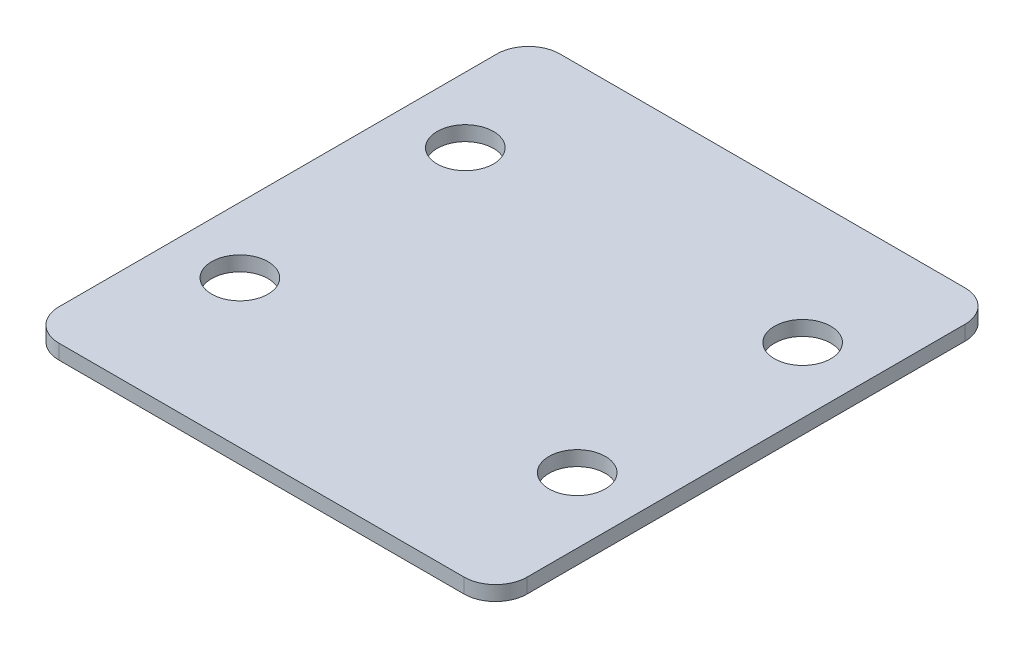
ISO-10303-21;
HEADER;
FILE_DESCRIPTION(('STEP AP214'),'2;1');
FILE_NAME('part.step','',(''),(''),'','','');
FILE_SCHEMA(('AUTOMOTIVE_DESIGN { 1 0 10303 214 1 1 1 1 }'));
ENDSEC;
DATA;
#1=APPLICATION_CONTEXT('core data for automotive mechanical design processes');
#2=APPLICATION_PROTOCOL_DEFINITION('international standard','automotive_design',2000,#1);
#3=PRODUCT_CONTEXT('',#1,'mechanical');
#4=PRODUCT('Part','Part','',(#3));
#5=PRODUCT_RELATED_PRODUCT_CATEGORY('part','',(#4));
#6=PRODUCT_DEFINITION_FORMATION('','',#4);
#7=PRODUCT_DEFINITION_CONTEXT('part definition',#1,'design');
#8=PRODUCT_DEFINITION('design','',#6,#7);
#9=PRODUCT_DEFINITION_SHAPE('','',#8);
#10=(LENGTH_UNIT() NAMED_UNIT(*) SI_UNIT(.MILLI.,.METRE.));
#11=(NAMED_UNIT(*) PLANE_ANGLE_UNIT() SI_UNIT($,.RADIAN.));
#12=(NAMED_UNIT(*) SI_UNIT($,.STERADIAN.) SOLID_ANGLE_UNIT());
#13=UNCERTAINTY_MEASURE_WITH_UNIT(LENGTH_MEASURE(1.E-05),#10,'distance_accuracy_value','');
#14=(GEOMETRIC_REPRESENTATION_CONTEXT(3) GLOBAL_UNCERTAINTY_ASSIGNED_CONTEXT((#13)) GLOBAL_UNIT_ASSIGNED_CONTEXT((#10,
#11,#12)) REPRESENTATION_CONTEXT('',''));
#15=CARTESIAN_POINT('',(0.,0.,0.));
#16=DIRECTION('',(0.,0.,1.));
#17=DIRECTION('',(1.,0.,0.));
#18=AXIS2_PLACEMENT_3D('',#15,#16,#17);
#19=CARTESIAN_POINT('',(28.2702,-29.2608,30.2514));
#20=DIRECTION('',(0.,-1.,0.));
#21=DIRECTION('',(0.,0.,-1.));
#22=AXIS2_PLACEMENT_3D('',#19,#20,#21);
#23=PLANE('',#22);
#24=CARTESIAN_POINT('',(24.3205,-29.2608,21.3741));
#25=DIRECTION('',(0.,1.,0.));
#26=DIRECTION('',(0.,0.,-1.));
#27=AXIS2_PLACEMENT_3D('',#24,#25,#26);
#28=CIRCLE('',#27,1.7018);
#29=CARTESIAN_POINT('',(24.3205,-29.2608,19.6723));
#30=VERTEX_POINT('',#29);
#31=EDGE_CURVE('E144',#30,#30,#28,.T.);
#32=ORIENTED_EDGE('',*,*,#31,.F.);
#33=EDGE_LOOP('',(#32));
#34=FACE_BOUND('',#33,.T.);
#35=CARTESIAN_POINT('',(3.9497,-29.2608,21.3741));
#36=DIRECTION('',(0.,1.,0.));
#37=DIRECTION('',(0.,0.,1.));
#38=AXIS2_PLACEMENT_3D('',#35,#36,#37);
#39=CIRCLE('',#38,1.7018);
#40=CARTESIAN_POINT('',(3.9497,-29.2608,23.0759));
#41=VERTEX_POINT('',#40);
#42=EDGE_CURVE('E156',#41,#41,#39,.T.);
#43=ORIENTED_EDGE('',*,*,#42,.F.);
#44=EDGE_LOOP('',(#43));
#45=FACE_BOUND('',#44,.T.);
#46=CARTESIAN_POINT('',(3.9497,-29.2608,7.7597));
#47=DIRECTION('',(0.,1.,0.));
#48=DIRECTION('',(0.,0.,-1.));
#49=AXIS2_PLACEMENT_3D('',#46,#47,#48);
#50=CIRCLE('',#49,1.7018);
#51=CARTESIAN_POINT('',(3.9497,-29.2608,6.0579));
#52=VERTEX_POINT('',#51);
#53=EDGE_CURVE('E147',#52,#52,#50,.T.);
#54=ORIENTED_EDGE('',*,*,#53,.F.);
#55=EDGE_LOOP('',(#54));
#56=FACE_BOUND('',#55,.T.);
#57=CARTESIAN_POINT('',(24.3205,-29.2608,7.7597));
#58=DIRECTION('',(0.,1.,0.));
#59=DIRECTION('',(0.,0.,1.));
#60=AXIS2_PLACEMENT_3D('',#57,#58,#59);
#61=CIRCLE('',#60,1.7018);
#62=CARTESIAN_POINT('',(24.3205,-29.2608,9.4615));
#63=VERTEX_POINT('',#62);
#64=EDGE_CURVE('E151',#63,#63,#61,.T.);
#65=ORIENTED_EDGE('',*,*,#64,.F.);
#66=EDGE_LOOP('',(#65));
#67=FACE_BOUND('',#66,.T.);
#68=DIRECTION('',(1.,0.,0.));
#69=VECTOR('',#68,1.);
#70=CARTESIAN_POINT('',(0.,-29.2608,0.));
#71=LINE('',#70,#69);
#72=CARTESIAN_POINT('',(1.905,-29.2608,0.));
#73=VERTEX_POINT('',#72);
#74=CARTESIAN_POINT('',(26.3652,-29.2608,0.));
#75=VERTEX_POINT('',#74);
#76=EDGE_CURVE('E130',#73,#75,#71,.T.);
#77=ORIENTED_EDGE('',*,*,#76,.F.);
#78=CARTESIAN_POINT('',(1.905,-29.2608,1.905));
#79=DIRECTION('',(0.,-1.,0.));
#80=DIRECTION('',(0.,0.,-1.));
#81=AXIS2_PLACEMENT_3D('',#78,#79,#80);
#82=CIRCLE('',#81,1.905);
#83=CARTESIAN_POINT('',(0.,-29.2608,1.905));
#84=VERTEX_POINT('',#83);
#85=EDGE_CURVE('E112',#73,#84,#82,.F.);
#86=ORIENTED_EDGE('',*,*,#85,.T.);
#87=DIRECTION('',(0.,0.,1.));
#88=VECTOR('',#87,1.);
#89=CARTESIAN_POINT('',(0.,-29.2608,30.2514));
#90=LINE('',#89,#88);
#91=CARTESIAN_POINT('',(0.,-29.2608,28.3464));
#92=VERTEX_POINT('',#91);
#93=EDGE_CURVE('E171',#84,#92,#90,.T.);
#94=ORIENTED_EDGE('',*,*,#93,.T.);
#95=CARTESIAN_POINT('',(1.905,-29.2608,28.3464));
#96=DIRECTION('',(0.,-1.,0.));
#97=DIRECTION('',(0.,0.,-1.));
#98=AXIS2_PLACEMENT_3D('',#95,#96,#97);
#99=CIRCLE('',#98,1.905);
#100=CARTESIAN_POINT('',(1.905,-29.2608,30.2514));
#101=VERTEX_POINT('',#100);
#102=EDGE_CURVE('E135',#92,#101,#99,.F.);
#103=ORIENTED_EDGE('',*,*,#102,.T.);
#104=DIRECTION('',(-1.,0.,0.));
#105=VECTOR('',#104,1.);
#106=CARTESIAN_POINT('',(28.2702,-29.2608,30.2514));
#107=LINE('',#106,#105);
#108=CARTESIAN_POINT('',(26.3652,-29.2608,30.2514));
#109=VERTEX_POINT('',#108);
#110=EDGE_CURVE('E194',#109,#101,#107,.T.);
#111=ORIENTED_EDGE('',*,*,#110,.F.);
#112=CARTESIAN_POINT('',(26.3652,-29.2608,28.3464));
#113=DIRECTION('',(0.,-1.,0.));
#114=DIRECTION('',(0.,0.,-1.));
#115=AXIS2_PLACEMENT_3D('',#112,#113,#114);
#116=CIRCLE('',#115,1.905);
#117=CARTESIAN_POINT('',(28.2702,-29.2608,28.3464));
#118=VERTEX_POINT('',#117);
#119=EDGE_CURVE('E202',#109,#118,#116,.F.);
#120=ORIENTED_EDGE('',*,*,#119,.T.);
#121=DIRECTION('',(0.,0.,1.));
#122=VECTOR('',#121,1.);
#123=CARTESIAN_POINT('',(28.2702,-29.2608,30.2514));
#124=LINE('',#123,#122);
#125=CARTESIAN_POINT('',(28.2702,-29.2608,1.905));
#126=VERTEX_POINT('',#125);
#127=EDGE_CURVE('E175',#126,#118,#124,.T.);
#128=ORIENTED_EDGE('',*,*,#127,.F.);
#129=CARTESIAN_POINT('',(26.3652,-29.2608,1.905));
#130=DIRECTION('',(0.,-1.,0.));
#131=DIRECTION('',(0.,0.,-1.));
#132=AXIS2_PLACEMENT_3D('',#129,#130,#131);
#133=CIRCLE('',#132,1.905);
#134=EDGE_CURVE('E124',#126,#75,#133,.F.);
#135=ORIENTED_EDGE('',*,*,#134,.T.);
#136=EDGE_LOOP('',(#77,#86,#94,#103,#111,#120,#128,#135));
#137=FACE_BOUND('',#136,.T.);
#138=ADVANCED_FACE('F45',(#34,#45,#56,#67,#137),#23,.F.);
#139=CARTESIAN_POINT('',(28.2702,-30.1498,30.2514));
#140=DIRECTION('',(0.,0.,-1.));
#141=DIRECTION('',(-1.,0.,0.));
#142=AXIS2_PLACEMENT_3D('',#139,#140,#141);
#143=PLANE('',#142);
#144=DIRECTION('',(-1.,0.,0.));
#145=VECTOR('',#144,1.);
#146=CARTESIAN_POINT('',(28.2702,-30.1498,30.2514));
#147=LINE('',#146,#145);
#148=CARTESIAN_POINT('',(26.3652,-30.1498,30.2514));
#149=VERTEX_POINT('',#148);
#150=CARTESIAN_POINT('',(1.905,-30.1498,30.2514));
#151=VERTEX_POINT('',#150);
#152=EDGE_CURVE('E191',#149,#151,#147,.T.);
#153=ORIENTED_EDGE('',*,*,#152,.F.);
#154=DIRECTION('',(0.,-1.,0.));
#155=VECTOR('',#154,1.);
#156=CARTESIAN_POINT('',(26.3652,-30.1498,30.2514));
#157=LINE('',#156,#155);
#158=EDGE_CURVE('E11',#149,#109,#157,.F.);
#159=ORIENTED_EDGE('',*,*,#158,.T.);
#160=ORIENTED_EDGE('',*,*,#110,.T.);
#161=DIRECTION('',(0.,-1.,0.));
#162=VECTOR('',#161,1.);
#163=CARTESIAN_POINT('',(1.905,-30.1498,30.2514));
#164=LINE('',#163,#162);
#165=EDGE_CURVE('E54',#101,#151,#164,.T.);
#166=ORIENTED_EDGE('',*,*,#165,.T.);
#167=EDGE_LOOP('',(#153,#159,#160,#166));
#168=FACE_BOUND('',#167,.T.);
#169=ADVANCED_FACE('F230',(#168),#143,.F.);
#170=CARTESIAN_POINT('',(28.2702,-30.1498,0.));
#171=DIRECTION('',(0.,1.,0.));
#172=DIRECTION('',(0.,0.,1.));
#173=AXIS2_PLACEMENT_3D('',#170,#171,#172);
#174=PLANE('',#173);
#175=CARTESIAN_POINT('',(24.3205,-30.1498,21.3741));
#176=DIRECTION('',(0.,1.,0.));
#177=DIRECTION('',(0.,0.,-1.));
#178=AXIS2_PLACEMENT_3D('',#175,#176,#177);
#179=CIRCLE('',#178,1.7018);
#180=CARTESIAN_POINT('',(24.3205,-30.1498,19.6723));
#181=VERTEX_POINT('',#180);
#182=EDGE_CURVE('E140',#181,#181,#179,.T.);
#183=ORIENTED_EDGE('',*,*,#182,.T.);
#184=EDGE_LOOP('',(#183));
#185=FACE_BOUND('',#184,.T.);
#186=CARTESIAN_POINT('',(3.9497,-30.1498,21.3741));
#187=DIRECTION('',(0.,1.,0.));
#188=DIRECTION('',(0.,0.,1.));
#189=AXIS2_PLACEMENT_3D('',#186,#187,#188);
#190=CIRCLE('',#189,1.7018);
#191=CARTESIAN_POINT('',(3.9497,-30.1498,23.0759));
#192=VERTEX_POINT('',#191);
#193=EDGE_CURVE('E160',#192,#192,#190,.T.);
#194=ORIENTED_EDGE('',*,*,#193,.T.);
#195=EDGE_LOOP('',(#194));
#196=FACE_BOUND('',#195,.T.);
#197=CARTESIAN_POINT('',(3.9497,-30.1498,7.7597));
#198=DIRECTION('',(0.,1.,0.));
#199=DIRECTION('',(0.,0.,-1.));
#200=AXIS2_PLACEMENT_3D('',#197,#198,#199);
#201=CIRCLE('',#200,1.7018);
#202=CARTESIAN_POINT('',(3.9497,-30.1498,6.0579));
#203=VERTEX_POINT('',#202);
#204=EDGE_CURVE('E152',#203,#203,#201,.T.);
#205=ORIENTED_EDGE('',*,*,#204,.T.);
#206=EDGE_LOOP('',(#205));
#207=FACE_BOUND('',#206,.T.);
#208=CARTESIAN_POINT('',(24.3205,-30.1498,7.7597));
#209=DIRECTION('',(0.,1.,0.));
#210=DIRECTION('',(0.,0.,1.));
#211=AXIS2_PLACEMENT_3D('',#208,#209,#210);
#212=CIRCLE('',#211,1.7018);
#213=CARTESIAN_POINT('',(24.3205,-30.1498,9.4615));
#214=VERTEX_POINT('',#213);
#215=EDGE_CURVE('E167',#214,#214,#212,.T.);
#216=ORIENTED_EDGE('',*,*,#215,.T.);
#217=EDGE_LOOP('',(#216));
#218=FACE_BOUND('',#217,.T.);
#219=DIRECTION('',(0.,0.,-1.));
#220=VECTOR('',#219,1.);
#221=CARTESIAN_POINT('',(0.,-30.1498,0.));
#222=LINE('',#221,#220);
#223=CARTESIAN_POINT('',(0.,-30.1498,28.3464));
#224=VERTEX_POINT('',#223);
#225=CARTESIAN_POINT('',(0.,-30.1498,1.905));
#226=VERTEX_POINT('',#225);
#227=EDGE_CURVE('E180',#224,#226,#222,.T.);
#228=ORIENTED_EDGE('',*,*,#227,.T.);
#229=CARTESIAN_POINT('',(1.905,-30.1498,1.905));
#230=DIRECTION('',(0.,1.,0.));
#231=DIRECTION('',(0.,0.,1.));
#232=AXIS2_PLACEMENT_3D('',#229,#230,#231);
#233=CIRCLE('',#232,1.905);
#234=CARTESIAN_POINT('',(1.905,-30.1498,0.));
#235=VERTEX_POINT('',#234);
#236=EDGE_CURVE('E218',#226,#235,#233,.F.);
#237=ORIENTED_EDGE('',*,*,#236,.T.);
#238=DIRECTION('',(-1.,0.,0.));
#239=VECTOR('',#238,1.);
#240=CARTESIAN_POINT('',(28.2702,-30.1498,0.));
#241=LINE('',#240,#239);
#242=CARTESIAN_POINT('',(26.3652,-30.1498,0.));
#243=VERTEX_POINT('',#242);
#244=EDGE_CURVE('E133',#243,#235,#241,.T.);
#245=ORIENTED_EDGE('',*,*,#244,.F.);
#246=CARTESIAN_POINT('',(26.3652,-30.1498,1.905));
#247=DIRECTION('',(0.,1.,0.));
#248=DIRECTION('',(0.,0.,1.));
#249=AXIS2_PLACEMENT_3D('',#246,#247,#248);
#250=CIRCLE('',#249,1.905);
#251=CARTESIAN_POINT('',(28.2702,-30.1498,1.905));
#252=VERTEX_POINT('',#251);
#253=EDGE_CURVE('E215',#243,#252,#250,.F.);
#254=ORIENTED_EDGE('',*,*,#253,.T.);
#255=DIRECTION('',(0.,0.,-1.));
#256=VECTOR('',#255,1.);
#257=CARTESIAN_POINT('',(28.2702,-30.1498,0.));
#258=LINE('',#257,#256);
#259=CARTESIAN_POINT('',(28.2702,-30.1498,28.3464));
#260=VERTEX_POINT('',#259);
#261=EDGE_CURVE('E179',#260,#252,#258,.T.);
#262=ORIENTED_EDGE('',*,*,#261,.F.);
#263=CARTESIAN_POINT('',(26.3652,-30.1498,28.3464));
#264=DIRECTION('',(0.,1.,0.));
#265=DIRECTION('',(0.,0.,1.));
#266=AXIS2_PLACEMENT_3D('',#263,#264,#265);
#267=CIRCLE('',#266,1.905);
#268=EDGE_CURVE('E69',#260,#149,#267,.F.);
#269=ORIENTED_EDGE('',*,*,#268,.T.);
#270=ORIENTED_EDGE('',*,*,#152,.T.);
#271=CARTESIAN_POINT('',(1.905,-30.1498,28.3464));
#272=DIRECTION('',(0.,1.,0.));
#273=DIRECTION('',(0.,0.,1.));
#274=AXIS2_PLACEMENT_3D('',#271,#272,#273);
#275=CIRCLE('',#274,1.905);
#276=EDGE_CURVE('E61',#151,#224,#275,.F.);
#277=ORIENTED_EDGE('',*,*,#276,.T.);
#278=EDGE_LOOP('',(#228,#237,#245,#254,#262,#269,#270,#277));
#279=FACE_BOUND('',#278,.T.);
#280=ADVANCED_FACE('F234',(#185,#196,#207,#218,#279),#174,.F.);
#281=CARTESIAN_POINT('',(28.2702,0.,0.));
#282=DIRECTION('',(0.,0.,1.));
#283=DIRECTION('',(0.,-1.,0.));
#284=AXIS2_PLACEMENT_3D('',#281,#282,#283);
#285=PLANE('',#284);
#286=ORIENTED_EDGE('',*,*,#244,.T.);
#287=DIRECTION('',(0.,1.,0.));
#288=VECTOR('',#287,1.);
#289=CARTESIAN_POINT('',(1.905,-29.2608,0.));
#290=LINE('',#289,#288);
#291=EDGE_CURVE('E116',#235,#73,#290,.T.);
#292=ORIENTED_EDGE('',*,*,#291,.T.);
#293=ORIENTED_EDGE('',*,*,#76,.T.);
#294=DIRECTION('',(0.,1.,0.));
#295=VECTOR('',#294,1.);
#296=CARTESIAN_POINT('',(26.3652,0.,0.));
#297=LINE('',#296,#295);
#298=EDGE_CURVE('E136',#75,#243,#297,.F.);
#299=ORIENTED_EDGE('',*,*,#298,.T.);
#300=EDGE_LOOP('',(#286,#292,#293,#299));
#301=FACE_BOUND('',#300,.T.);
#302=ADVANCED_FACE('F129',(#301),#285,.F.);
#303=CARTESIAN_POINT('',(28.2702,0.,0.));
#304=DIRECTION('',(-1.,0.,0.));
#305=DIRECTION('',(0.,0.,1.));
#306=AXIS2_PLACEMENT_3D('',#303,#304,#305);
#307=PLANE('',#306);
#308=ORIENTED_EDGE('',*,*,#261,.T.);
#309=DIRECTION('',(0.,1.,0.));
#310=VECTOR('',#309,1.);
#311=CARTESIAN_POINT('',(28.2702,0.,1.905));
#312=LINE('',#311,#310);
#313=EDGE_CURVE('E225',#252,#126,#312,.T.);
#314=ORIENTED_EDGE('',*,*,#313,.T.);
#315=ORIENTED_EDGE('',*,*,#127,.T.);
#316=DIRECTION('',(0.,-1.,0.));
#317=VECTOR('',#316,1.);
#318=CARTESIAN_POINT('',(28.2702,0.,28.3464));
#319=LINE('',#318,#317);
#320=EDGE_CURVE('E221',#118,#260,#319,.T.);
#321=ORIENTED_EDGE('',*,*,#320,.T.);
#322=EDGE_LOOP('',(#308,#314,#315,#321));
#323=FACE_BOUND('',#322,.T.);
#324=ADVANCED_FACE('F243',(#323),#307,.F.);
#325=CARTESIAN_POINT('',(0.,0.,0.));
#326=DIRECTION('',(-1.,0.,0.));
#327=DIRECTION('',(0.,0.,1.));
#328=AXIS2_PLACEMENT_3D('',#325,#326,#327);
#329=PLANE('',#328);
#330=ORIENTED_EDGE('',*,*,#93,.F.);
#331=DIRECTION('',(0.,1.,0.));
#332=VECTOR('',#331,1.);
#333=CARTESIAN_POINT('',(0.,-30.1498,1.905));
#334=LINE('',#333,#332);
#335=EDGE_CURVE('E117',#84,#226,#334,.F.);
#336=ORIENTED_EDGE('',*,*,#335,.T.);
#337=ORIENTED_EDGE('',*,*,#227,.F.);
#338=DIRECTION('',(0.,-1.,0.));
#339=VECTOR('',#338,1.);
#340=CARTESIAN_POINT('',(0.,-29.2608,28.3464));
#341=LINE('',#340,#339);
#342=EDGE_CURVE('E123',#224,#92,#341,.F.);
#343=ORIENTED_EDGE('',*,*,#342,.T.);
#344=EDGE_LOOP('',(#330,#336,#337,#343));
#345=FACE_BOUND('',#344,.T.);
#346=ADVANCED_FACE('F237',(#345),#329,.T.);
#347=CARTESIAN_POINT('',(24.3205,-30.1498,7.7597));
#348=DIRECTION('',(0.,1.,0.));
#349=DIRECTION('',(0.,0.,1.));
#350=AXIS2_PLACEMENT_3D('',#347,#348,#349);
#351=CYLINDRICAL_SURFACE('',#350,1.7018);
#352=ORIENTED_EDGE('',*,*,#215,.F.);
#353=EDGE_LOOP('',(#352));
#354=FACE_BOUND('',#353,.T.);
#355=ORIENTED_EDGE('',*,*,#64,.T.);
#356=EDGE_LOOP('',(#355));
#357=FACE_BOUND('',#356,.T.);
#358=ADVANCED_FACE('F274',(#354,#357),#351,.F.);
#359=CARTESIAN_POINT('',(3.9497,-30.1498,7.7597));
#360=DIRECTION('',(0.,1.,0.));
#361=DIRECTION('',(0.,0.,1.));
#362=AXIS2_PLACEMENT_3D('',#359,#360,#361);
#363=CYLINDRICAL_SURFACE('',#362,1.7018);
#364=ORIENTED_EDGE('',*,*,#204,.F.);
#365=EDGE_LOOP('',(#364));
#366=FACE_BOUND('',#365,.T.);
#367=ORIENTED_EDGE('',*,*,#53,.T.);
#368=EDGE_LOOP('',(#367));
#369=FACE_BOUND('',#368,.T.);
#370=ADVANCED_FACE('F279',(#366,#369),#363,.F.);
#371=CARTESIAN_POINT('',(3.9497,-30.1498,21.3741));
#372=DIRECTION('',(0.,1.,0.));
#373=DIRECTION('',(0.,0.,1.));
#374=AXIS2_PLACEMENT_3D('',#371,#372,#373);
#375=CYLINDRICAL_SURFACE('',#374,1.7018);
#376=ORIENTED_EDGE('',*,*,#193,.F.);
#377=EDGE_LOOP('',(#376));
#378=FACE_BOUND('',#377,.T.);
#379=ORIENTED_EDGE('',*,*,#42,.T.);
#380=EDGE_LOOP('',(#379));
#381=FACE_BOUND('',#380,.T.);
#382=ADVANCED_FACE('F282',(#378,#381),#375,.F.);
#383=CARTESIAN_POINT('',(24.3205,-30.1498,21.3741));
#384=DIRECTION('',(0.,1.,0.));
#385=DIRECTION('',(0.,0.,1.));
#386=AXIS2_PLACEMENT_3D('',#383,#384,#385);
#387=CYLINDRICAL_SURFACE('',#386,1.7018);
#388=ORIENTED_EDGE('',*,*,#182,.F.);
#389=EDGE_LOOP('',(#388));
#390=FACE_BOUND('',#389,.T.);
#391=ORIENTED_EDGE('',*,*,#31,.T.);
#392=EDGE_LOOP('',(#391));
#393=FACE_BOUND('',#392,.T.);
#394=ADVANCED_FACE('F254',(#390,#393),#387,.F.);
#395=CARTESIAN_POINT('',(1.905,0.,1.905));
#396=DIRECTION('',(0.,-1.,0.));
#397=DIRECTION('',(0.,0.,-1.));
#398=AXIS2_PLACEMENT_3D('',#395,#396,#397);
#399=CYLINDRICAL_SURFACE('',#398,1.905);
#400=ORIENTED_EDGE('',*,*,#236,.F.);
#401=ORIENTED_EDGE('',*,*,#335,.F.);
#402=ORIENTED_EDGE('',*,*,#85,.F.);
#403=ORIENTED_EDGE('',*,*,#291,.F.);
#404=EDGE_LOOP('',(#400,#401,#402,#403));
#405=FACE_BOUND('',#404,.T.);
#406=ADVANCED_FACE('F115',(#405),#399,.T.);
#407=CARTESIAN_POINT('',(26.3652,0.,1.905));
#408=DIRECTION('',(0.,1.,0.));
#409=DIRECTION('',(0.,0.,1.));
#410=AXIS2_PLACEMENT_3D('',#407,#408,#409);
#411=CYLINDRICAL_SURFACE('',#410,1.905);
#412=ORIENTED_EDGE('',*,*,#253,.F.);
#413=ORIENTED_EDGE('',*,*,#298,.F.);
#414=ORIENTED_EDGE('',*,*,#134,.F.);
#415=ORIENTED_EDGE('',*,*,#313,.F.);
#416=EDGE_LOOP('',(#412,#413,#414,#415));
#417=FACE_BOUND('',#416,.T.);
#418=ADVANCED_FACE('F247',(#417),#411,.T.);
#419=CARTESIAN_POINT('',(26.3652,0.,28.3464));
#420=DIRECTION('',(0.,-1.,0.));
#421=DIRECTION('',(0.,0.,-1.));
#422=AXIS2_PLACEMENT_3D('',#419,#420,#421);
#423=CYLINDRICAL_SURFACE('',#422,1.905);
#424=ORIENTED_EDGE('',*,*,#119,.F.);
#425=ORIENTED_EDGE('',*,*,#158,.F.);
#426=ORIENTED_EDGE('',*,*,#268,.F.);
#427=ORIENTED_EDGE('',*,*,#320,.F.);
#428=EDGE_LOOP('',(#424,#425,#426,#427));
#429=FACE_BOUND('',#428,.T.);
#430=ADVANCED_FACE('F241',(#429),#423,.T.);
#431=CARTESIAN_POINT('',(1.905,-30.1498,28.3464));
#432=DIRECTION('',(0.,1.,0.));
#433=DIRECTION('',(0.,0.,1.));
#434=AXIS2_PLACEMENT_3D('',#431,#432,#433);
#435=CYLINDRICAL_SURFACE('',#434,1.905);
#436=ORIENTED_EDGE('',*,*,#102,.F.);
#437=ORIENTED_EDGE('',*,*,#342,.F.);
#438=ORIENTED_EDGE('',*,*,#276,.F.);
#439=ORIENTED_EDGE('',*,*,#165,.F.);
#440=EDGE_LOOP('',(#436,#437,#438,#439));
#441=FACE_BOUND('',#440,.T.);
#442=ADVANCED_FACE('F47',(#441),#435,.T.);
#443=CLOSED_SHELL('',(#138,#169,#280,#302,#324,#346,#358,#370,#382,#394,#406,#418,#430,#442));
#444=MANIFOLD_SOLID_BREP('B2',#443);
#445=ADVANCED_BREP_SHAPE_REPRESENTATION('',(#18,#444),#14);
#446=SHAPE_DEFINITION_REPRESENTATION(#9,#445);
ENDSEC;
END-ISO-10303-21;
